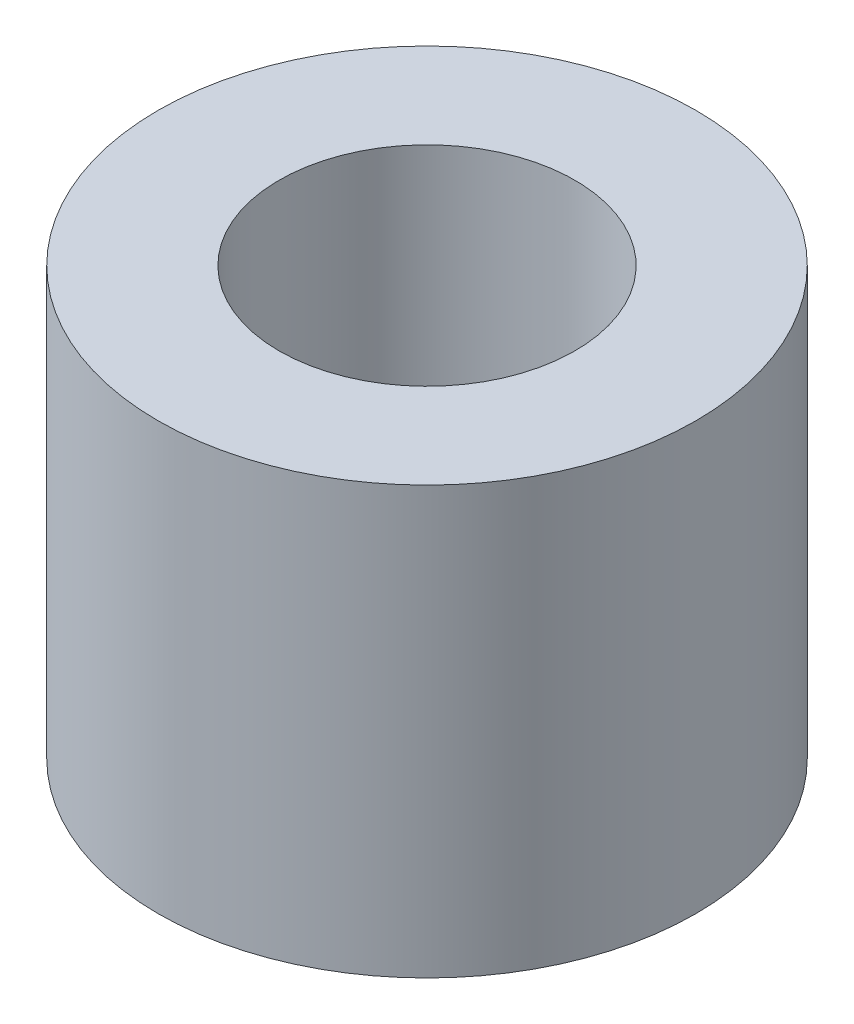
ISO-10303-21;
HEADER;
FILE_DESCRIPTION(('STEP AP214'),'2;1');
FILE_NAME('part.step','',(''),(''),'','','');
FILE_SCHEMA(('AUTOMOTIVE_DESIGN { 1 0 10303 214 1 1 1 1 }'));
ENDSEC;
DATA;
#1=APPLICATION_CONTEXT('core data for automotive mechanical design processes');
#2=APPLICATION_PROTOCOL_DEFINITION('international standard','automotive_design',2000,#1);
#3=PRODUCT_CONTEXT('',#1,'mechanical');
#4=PRODUCT('Part','Part','',(#3));
#5=PRODUCT_RELATED_PRODUCT_CATEGORY('part','',(#4));
#6=PRODUCT_DEFINITION_FORMATION('','',#4);
#7=PRODUCT_DEFINITION_CONTEXT('part definition',#1,'design');
#8=PRODUCT_DEFINITION('design','',#6,#7);
#9=PRODUCT_DEFINITION_SHAPE('','',#8);
#10=(LENGTH_UNIT() NAMED_UNIT(*) SI_UNIT(.MILLI.,.METRE.));
#11=(NAMED_UNIT(*) PLANE_ANGLE_UNIT() SI_UNIT($,.RADIAN.));
#12=(NAMED_UNIT(*) SI_UNIT($,.STERADIAN.) SOLID_ANGLE_UNIT());
#13=UNCERTAINTY_MEASURE_WITH_UNIT(LENGTH_MEASURE(1.E-05),#10,'distance_accuracy_value','');
#14=(GEOMETRIC_REPRESENTATION_CONTEXT(3) GLOBAL_UNCERTAINTY_ASSIGNED_CONTEXT((#13)) GLOBAL_UNIT_ASSIGNED_CONTEXT((#10,
#11,#12)) REPRESENTATION_CONTEXT('',''));
#15=CARTESIAN_POINT('',(0.,0.,0.));
#16=DIRECTION('',(0.,0.,1.));
#17=DIRECTION('',(1.,0.,0.));
#18=AXIS2_PLACEMENT_3D('',#15,#16,#17);
#19=CARTESIAN_POINT('',(0.,3.175,0.));
#20=DIRECTION('',(0.,1.,0.));
#21=DIRECTION('',(0.,0.,1.));
#22=AXIS2_PLACEMENT_3D('',#19,#20,#21);
#23=PLANE('',#22);
#24=CARTESIAN_POINT('',(0.,3.175,0.));
#25=DIRECTION('',(0.,1.,0.));
#26=DIRECTION('',(0.,0.,1.));
#27=AXIS2_PLACEMENT_3D('',#24,#25,#26);
#28=CIRCLE('',#27,2.);
#29=CARTESIAN_POINT('',(0.,3.175,2.));
#30=VERTEX_POINT('',#29);
#31=EDGE_CURVE('E10',#30,#30,#28,.T.);
#32=ORIENTED_EDGE('',*,*,#31,.T.);
#33=EDGE_LOOP('',(#32));
#34=FACE_BOUND('',#33,.T.);
#35=CARTESIAN_POINT('',(0.,3.175,0.));
#36=DIRECTION('',(0.,1.,0.));
#37=DIRECTION('',(0.,0.,1.));
#38=AXIS2_PLACEMENT_3D('',#35,#36,#37);
#39=CIRCLE('',#38,1.1);
#40=CARTESIAN_POINT('',(0.,3.175,1.1));
#41=VERTEX_POINT('',#40);
#42=EDGE_CURVE('E50',#41,#41,#39,.T.);
#43=ORIENTED_EDGE('',*,*,#42,.F.);
#44=EDGE_LOOP('',(#43));
#45=FACE_BOUND('',#44,.T.);
#46=ADVANCED_FACE('F37',(#34,#45),#23,.T.);
#47=CARTESIAN_POINT('',(0.,0.,0.));
#48=DIRECTION('',(0.,1.,0.));
#49=DIRECTION('',(0.,0.,1.));
#50=AXIS2_PLACEMENT_3D('',#47,#48,#49);
#51=PLANE('',#50);
#52=CARTESIAN_POINT('',(0.,0.,0.));
#53=DIRECTION('',(0.,1.,0.));
#54=DIRECTION('',(0.,0.,1.));
#55=AXIS2_PLACEMENT_3D('',#52,#53,#54);
#56=CIRCLE('',#55,2.);
#57=CARTESIAN_POINT('',(0.,0.,2.));
#58=VERTEX_POINT('',#57);
#59=EDGE_CURVE('E41',#58,#58,#56,.T.);
#60=ORIENTED_EDGE('',*,*,#59,.F.);
#61=EDGE_LOOP('',(#60));
#62=FACE_BOUND('',#61,.T.);
#63=CARTESIAN_POINT('',(0.,0.,0.));
#64=DIRECTION('',(0.,1.,0.));
#65=DIRECTION('',(0.,0.,1.));
#66=AXIS2_PLACEMENT_3D('',#63,#64,#65);
#67=CIRCLE('',#66,1.1);
#68=CARTESIAN_POINT('',(0.,0.,1.1));
#69=VERTEX_POINT('',#68);
#70=EDGE_CURVE('E52',#69,#69,#67,.T.);
#71=ORIENTED_EDGE('',*,*,#70,.T.);
#72=EDGE_LOOP('',(#71));
#73=FACE_BOUND('',#72,.T.);
#74=ADVANCED_FACE('F64',(#62,#73),#51,.F.);
#75=CARTESIAN_POINT('',(0.,3.175,0.));
#76=DIRECTION('',(0.,-1.,0.));
#77=DIRECTION('',(0.,0.,-1.));
#78=AXIS2_PLACEMENT_3D('',#75,#76,#77);
#79=CYLINDRICAL_SURFACE('',#78,2.);
#80=ORIENTED_EDGE('',*,*,#31,.F.);
#81=EDGE_LOOP('',(#80));
#82=FACE_BOUND('',#81,.T.);
#83=ORIENTED_EDGE('',*,*,#59,.T.);
#84=EDGE_LOOP('',(#83));
#85=FACE_BOUND('',#84,.T.);
#86=ADVANCED_FACE('F39',(#82,#85),#79,.T.);
#87=CARTESIAN_POINT('',(0.,3.175,0.));
#88=DIRECTION('',(0.,-1.,0.));
#89=DIRECTION('',(0.,0.,-1.));
#90=AXIS2_PLACEMENT_3D('',#87,#88,#89);
#91=CYLINDRICAL_SURFACE('',#90,1.1);
#92=ORIENTED_EDGE('',*,*,#42,.T.);
#93=EDGE_LOOP('',(#92));
#94=FACE_BOUND('',#93,.T.);
#95=ORIENTED_EDGE('',*,*,#70,.F.);
#96=EDGE_LOOP('',(#95));
#97=FACE_BOUND('',#96,.T.);
#98=ADVANCED_FACE('F60',(#94,#97),#91,.F.);
#99=CLOSED_SHELL('',(#46,#74,#86,#98));
#100=MANIFOLD_SOLID_BREP('B2',#99);
#101=ADVANCED_BREP_SHAPE_REPRESENTATION('',(#18,#100),#14);
#102=SHAPE_DEFINITION_REPRESENTATION(#9,#101);
ENDSEC;
END-ISO-10303-21;
